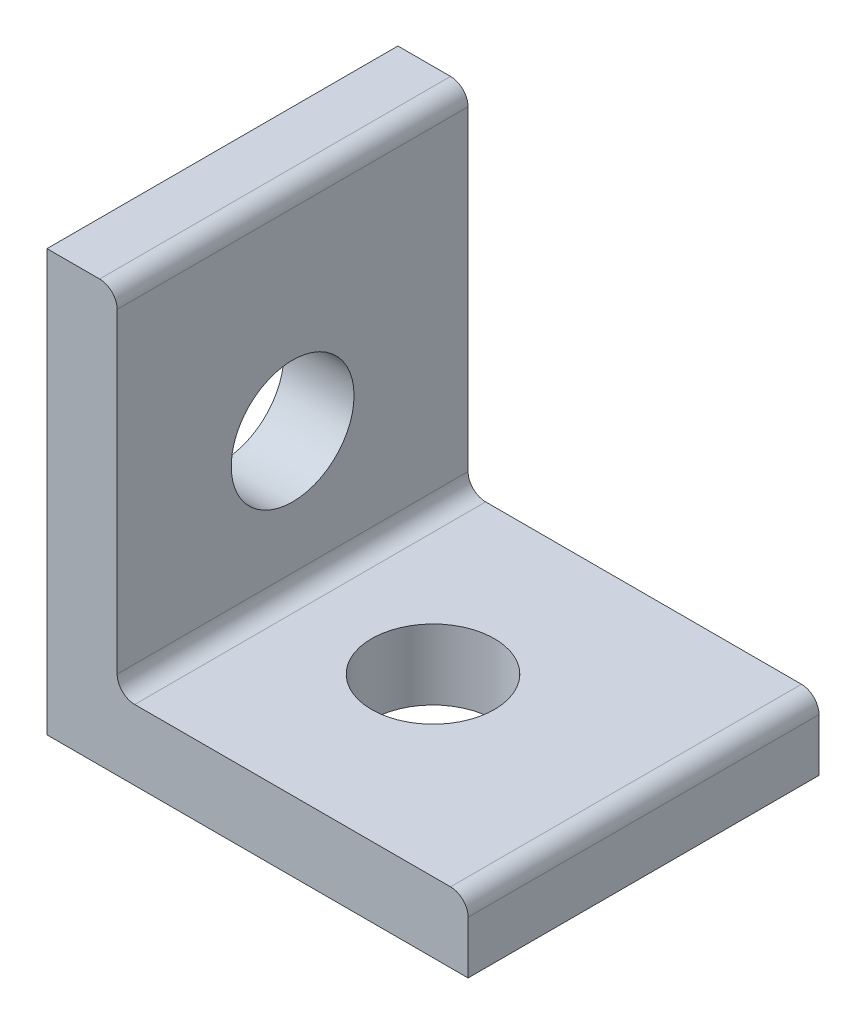
ISO-10303-21;
HEADER;
FILE_DESCRIPTION(('STEP AP214'),'2;1');
FILE_NAME('part.step','',(''),(''),'','','');
FILE_SCHEMA(('AUTOMOTIVE_DESIGN { 1 0 10303 214 1 1 1 1 }'));
ENDSEC;
DATA;
#1=APPLICATION_CONTEXT('core data for automotive mechanical design processes');
#2=APPLICATION_PROTOCOL_DEFINITION('international standard','automotive_design',2000,#1);
#3=PRODUCT_CONTEXT('',#1,'mechanical');
#4=PRODUCT('Part','Part','',(#3));
#5=PRODUCT_RELATED_PRODUCT_CATEGORY('part','',(#4));
#6=PRODUCT_DEFINITION_FORMATION('','',#4);
#7=PRODUCT_DEFINITION_CONTEXT('part definition',#1,'design');
#8=PRODUCT_DEFINITION('design','',#6,#7);
#9=PRODUCT_DEFINITION_SHAPE('','',#8);
#10=(LENGTH_UNIT() NAMED_UNIT(*) SI_UNIT(.MILLI.,.METRE.));
#11=(NAMED_UNIT(*) PLANE_ANGLE_UNIT() SI_UNIT($,.RADIAN.));
#12=(NAMED_UNIT(*) SI_UNIT($,.STERADIAN.) SOLID_ANGLE_UNIT());
#13=UNCERTAINTY_MEASURE_WITH_UNIT(LENGTH_MEASURE(1.E-05),#10,'distance_accuracy_value','');
#14=(GEOMETRIC_REPRESENTATION_CONTEXT(3) GLOBAL_UNCERTAINTY_ASSIGNED_CONTEXT((#13)) GLOBAL_UNIT_ASSIGNED_CONTEXT((#10,
#11,#12)) REPRESENTATION_CONTEXT('',''));
#15=CARTESIAN_POINT('',(0.,0.,0.));
#16=DIRECTION('',(0.,0.,1.));
#17=DIRECTION('',(1.,0.,0.));
#18=AXIS2_PLACEMENT_3D('',#15,#16,#17);
#19=CARTESIAN_POINT('',(-6.,6.,4.99999999999999));
#20=DIRECTION('',(0.,-1.,0.));
#21=DIRECTION('',(0.,0.,-1.));
#22=AXIS2_PLACEMENT_3D('',#19,#20,#21);
#23=PLANE('',#22);
#24=DIRECTION('',(-1.,0.,0.));
#25=VECTOR('',#24,1.);
#26=CARTESIAN_POINT('',(-6.,6.,-5.));
#27=LINE('',#26,#25);
#28=CARTESIAN_POINT('',(-4.5,6.,-5.));
#29=VERTEX_POINT('',#28);
#30=CARTESIAN_POINT('',(-6.,6.,-5.));
#31=VERTEX_POINT('',#30);
#32=EDGE_CURVE('E151',#29,#31,#27,.T.);
#33=ORIENTED_EDGE('',*,*,#32,.T.);
#34=DIRECTION('',(0.,0.,-1.));
#35=VECTOR('',#34,1.);
#36=CARTESIAN_POINT('',(-6.,6.,4.99999999999999));
#37=LINE('',#36,#35);
#38=CARTESIAN_POINT('',(-6.,6.,4.99999999999999));
#39=VERTEX_POINT('',#38);
#40=EDGE_CURVE('E11',#39,#31,#37,.T.);
#41=ORIENTED_EDGE('',*,*,#40,.F.);
#42=DIRECTION('',(-1.,0.,0.));
#43=VECTOR('',#42,1.);
#44=CARTESIAN_POINT('',(-6.,6.,4.99999999999999));
#45=LINE('',#44,#43);
#46=CARTESIAN_POINT('',(-4.5,6.,4.99999999999999));
#47=VERTEX_POINT('',#46);
#48=EDGE_CURVE('E177',#47,#39,#45,.T.);
#49=ORIENTED_EDGE('',*,*,#48,.F.);
#50=DIRECTION('',(0.,0.,-1.));
#51=VECTOR('',#50,1.);
#52=CARTESIAN_POINT('',(-4.5,6.,4.99999999999999));
#53=LINE('',#52,#51);
#54=EDGE_CURVE('E147',#47,#29,#53,.T.);
#55=ORIENTED_EDGE('',*,*,#54,.T.);
#56=EDGE_LOOP('',(#33,#41,#49,#55));
#57=FACE_BOUND('',#56,.T.);
#58=ADVANCED_FACE('F41',(#57),#23,.F.);
#59=CARTESIAN_POINT('',(-6.,6.,4.99999999999999));
#60=DIRECTION('',(1.,0.,0.));
#61=DIRECTION('',(0.,0.,-1.));
#62=AXIS2_PLACEMENT_3D('',#59,#60,#61);
#63=PLANE('',#62);
#64=CARTESIAN_POINT('',(-6.,0.,0.));
#65=DIRECTION('',(1.,0.,0.));
#66=DIRECTION('',(0.,0.,-1.));
#67=AXIS2_PLACEMENT_3D('',#64,#65,#66);
#68=CIRCLE('',#67,1.75);
#69=CARTESIAN_POINT('',(-6.,0.,-1.75));
#70=VERTEX_POINT('',#69);
#71=EDGE_CURVE('E200',#70,#70,#68,.T.);
#72=ORIENTED_EDGE('',*,*,#71,.T.);
#73=EDGE_LOOP('',(#72));
#74=FACE_BOUND('',#73,.T.);
#75=DIRECTION('',(0.,-1.,0.));
#76=VECTOR('',#75,1.);
#77=CARTESIAN_POINT('',(-6.,6.,-5.));
#78=LINE('',#77,#76);
#79=CARTESIAN_POINT('',(-6.,-6.,-5.));
#80=VERTEX_POINT('',#79);
#81=EDGE_CURVE('E155',#31,#80,#78,.T.);
#82=ORIENTED_EDGE('',*,*,#81,.T.);
#83=DIRECTION('',(0.,0.,-1.));
#84=VECTOR('',#83,1.);
#85=CARTESIAN_POINT('',(-6.,-6.,4.99999999999999));
#86=LINE('',#85,#84);
#87=CARTESIAN_POINT('',(-6.,-6.,4.99999999999999));
#88=VERTEX_POINT('',#87);
#89=EDGE_CURVE('E51',#88,#80,#86,.T.);
#90=ORIENTED_EDGE('',*,*,#89,.F.);
#91=DIRECTION('',(0.,-1.,0.));
#92=VECTOR('',#91,1.);
#93=CARTESIAN_POINT('',(-6.,6.,4.99999999999999));
#94=LINE('',#93,#92);
#95=EDGE_CURVE('E106',#39,#88,#94,.T.);
#96=ORIENTED_EDGE('',*,*,#95,.F.);
#97=ORIENTED_EDGE('',*,*,#40,.T.);
#98=EDGE_LOOP('',(#82,#90,#96,#97));
#99=FACE_BOUND('',#98,.T.);
#100=ADVANCED_FACE('F272',(#74,#99),#63,.F.);
#101=CARTESIAN_POINT('',(-6.,-6.,4.99999999999999));
#102=DIRECTION('',(0.,1.,0.));
#103=DIRECTION('',(0.,0.,1.));
#104=AXIS2_PLACEMENT_3D('',#101,#102,#103);
#105=PLANE('',#104);
#106=CARTESIAN_POINT('',(0.,-6.,0.));
#107=DIRECTION('',(0.,1.,0.));
#108=DIRECTION('',(0.,0.,1.));
#109=AXIS2_PLACEMENT_3D('',#106,#107,#108);
#110=CIRCLE('',#109,1.75);
#111=CARTESIAN_POINT('',(0.,-6.,1.75));
#112=VERTEX_POINT('',#111);
#113=EDGE_CURVE('E212',#112,#112,#110,.T.);
#114=ORIENTED_EDGE('',*,*,#113,.T.);
#115=EDGE_LOOP('',(#114));
#116=FACE_BOUND('',#115,.T.);
#117=DIRECTION('',(1.,0.,0.));
#118=VECTOR('',#117,1.);
#119=CARTESIAN_POINT('',(-6.,-6.,-5.));
#120=LINE('',#119,#118);
#121=CARTESIAN_POINT('',(6.,-6.,-5.));
#122=VERTEX_POINT('',#121);
#123=EDGE_CURVE('E159',#80,#122,#120,.T.);
#124=ORIENTED_EDGE('',*,*,#123,.T.);
#125=DIRECTION('',(0.,0.,-1.));
#126=VECTOR('',#125,1.);
#127=CARTESIAN_POINT('',(6.,-6.,4.99999999999999));
#128=LINE('',#127,#126);
#129=CARTESIAN_POINT('',(6.,-6.,4.99999999999999));
#130=VERTEX_POINT('',#129);
#131=EDGE_CURVE('E192',#130,#122,#128,.T.);
#132=ORIENTED_EDGE('',*,*,#131,.F.);
#133=DIRECTION('',(1.,0.,0.));
#134=VECTOR('',#133,1.);
#135=CARTESIAN_POINT('',(-6.,-6.,4.99999999999999));
#136=LINE('',#135,#134);
#137=EDGE_CURVE('E219',#88,#130,#136,.T.);
#138=ORIENTED_EDGE('',*,*,#137,.F.);
#139=ORIENTED_EDGE('',*,*,#89,.T.);
#140=EDGE_LOOP('',(#124,#132,#138,#139));
#141=FACE_BOUND('',#140,.T.);
#142=ADVANCED_FACE('F276',(#116,#141),#105,.F.);
#143=CARTESIAN_POINT('',(6.,-6.,4.99999999999999));
#144=DIRECTION('',(-1.,0.,0.));
#145=DIRECTION('',(0.,0.,1.));
#146=AXIS2_PLACEMENT_3D('',#143,#144,#145);
#147=PLANE('',#146);
#148=DIRECTION('',(0.,1.,0.));
#149=VECTOR('',#148,1.);
#150=CARTESIAN_POINT('',(6.,-6.,-5.));
#151=LINE('',#150,#149);
#152=CARTESIAN_POINT('',(6.,-4.5,-5.));
#153=VERTEX_POINT('',#152);
#154=EDGE_CURVE('E162',#122,#153,#151,.T.);
#155=ORIENTED_EDGE('',*,*,#154,.T.);
#156=DIRECTION('',(0.,0.,-1.));
#157=VECTOR('',#156,1.);
#158=CARTESIAN_POINT('',(6.,-4.5,4.99999999999999));
#159=LINE('',#158,#157);
#160=CARTESIAN_POINT('',(6.,-4.5,4.99999999999999));
#161=VERTEX_POINT('',#160);
#162=EDGE_CURVE('E188',#161,#153,#159,.T.);
#163=ORIENTED_EDGE('',*,*,#162,.F.);
#164=DIRECTION('',(0.,1.,0.));
#165=VECTOR('',#164,1.);
#166=CARTESIAN_POINT('',(6.,-6.,4.99999999999999));
#167=LINE('',#166,#165);
#168=EDGE_CURVE('E222',#130,#161,#167,.T.);
#169=ORIENTED_EDGE('',*,*,#168,.F.);
#170=ORIENTED_EDGE('',*,*,#131,.T.);
#171=EDGE_LOOP('',(#155,#163,#169,#170));
#172=FACE_BOUND('',#171,.T.);
#173=ADVANCED_FACE('F280',(#172),#147,.F.);
#174=CARTESIAN_POINT('',(5.5,-4.5,4.99999999999999));
#175=DIRECTION('',(0.,0.,-1.));
#176=DIRECTION('',(-1.,0.,0.));
#177=AXIS2_PLACEMENT_3D('',#174,#175,#176);
#178=CYLINDRICAL_SURFACE('',#177,0.5);
#179=CARTESIAN_POINT('',(5.5,-4.5,-5.));
#180=DIRECTION('',(0.,0.,1.));
#181=DIRECTION('',(1.,0.,0.));
#182=AXIS2_PLACEMENT_3D('',#179,#180,#181);
#183=CIRCLE('',#182,0.5);
#184=CARTESIAN_POINT('',(5.5,-4.,-5.));
#185=VERTEX_POINT('',#184);
#186=EDGE_CURVE('E165',#153,#185,#183,.T.);
#187=ORIENTED_EDGE('',*,*,#186,.T.);
#188=DIRECTION('',(0.,0.,-1.));
#189=VECTOR('',#188,1.);
#190=CARTESIAN_POINT('',(5.5,-4.,4.99999999999999));
#191=LINE('',#190,#189);
#192=CARTESIAN_POINT('',(5.5,-4.,4.99999999999999));
#193=VERTEX_POINT('',#192);
#194=EDGE_CURVE('E184',#193,#185,#191,.T.);
#195=ORIENTED_EDGE('',*,*,#194,.F.);
#196=CARTESIAN_POINT('',(5.5,-4.5,4.99999999999999));
#197=DIRECTION('',(0.,0.,1.));
#198=DIRECTION('',(1.,0.,0.));
#199=AXIS2_PLACEMENT_3D('',#196,#197,#198);
#200=CIRCLE('',#199,0.5);
#201=EDGE_CURVE('E225',#161,#193,#200,.T.);
#202=ORIENTED_EDGE('',*,*,#201,.F.);
#203=ORIENTED_EDGE('',*,*,#162,.T.);
#204=EDGE_LOOP('',(#187,#195,#202,#203));
#205=FACE_BOUND('',#204,.T.);
#206=ADVANCED_FACE('F249',(#205),#178,.T.);
#207=CARTESIAN_POINT('',(5.5,-4.,4.99999999999999));
#208=DIRECTION('',(0.,-1.,0.));
#209=DIRECTION('',(1.,0.,0.));
#210=AXIS2_PLACEMENT_3D('',#207,#208,#209);
#211=PLANE('',#210);
#212=CARTESIAN_POINT('',(0.,-4.,0.));
#213=DIRECTION('',(0.,-1.,0.));
#214=DIRECTION('',(1.,0.,0.));
#215=AXIS2_PLACEMENT_3D('',#212,#213,#214);
#216=CIRCLE('',#215,1.75);
#217=CARTESIAN_POINT('',(0.,-4.,1.75));
#218=VERTEX_POINT('',#217);
#219=EDGE_CURVE('E44',#218,#218,#216,.T.);
#220=ORIENTED_EDGE('',*,*,#219,.T.);
#221=EDGE_LOOP('',(#220));
#222=FACE_BOUND('',#221,.T.);
#223=DIRECTION('',(-1.,0.,0.));
#224=VECTOR('',#223,1.);
#225=CARTESIAN_POINT('',(5.5,-4.,-5.));
#226=LINE('',#225,#224);
#227=CARTESIAN_POINT('',(-3.5,-4.,-5.));
#228=VERTEX_POINT('',#227);
#229=EDGE_CURVE('E168',#185,#228,#226,.T.);
#230=ORIENTED_EDGE('',*,*,#229,.T.);
#231=DIRECTION('',(0.,0.,-1.));
#232=VECTOR('',#231,1.);
#233=CARTESIAN_POINT('',(-3.5,-4.,4.99999999999999));
#234=LINE('',#233,#232);
#235=CARTESIAN_POINT('',(-3.5,-4.,4.99999999999999));
#236=VERTEX_POINT('',#235);
#237=EDGE_CURVE('E139',#236,#228,#234,.T.);
#238=ORIENTED_EDGE('',*,*,#237,.F.);
#239=DIRECTION('',(-1.,0.,0.));
#240=VECTOR('',#239,1.);
#241=CARTESIAN_POINT('',(5.5,-4.,4.99999999999999));
#242=LINE('',#241,#240);
#243=EDGE_CURVE('E128',#193,#236,#242,.T.);
#244=ORIENTED_EDGE('',*,*,#243,.F.);
#245=ORIENTED_EDGE('',*,*,#194,.T.);
#246=EDGE_LOOP('',(#230,#238,#244,#245));
#247=FACE_BOUND('',#246,.T.);
#248=ADVANCED_FACE('F253',(#222,#247),#211,.F.);
#249=CARTESIAN_POINT('',(-3.5,-3.5,4.99999999999999));
#250=DIRECTION('',(0.,0.,-1.));
#251=DIRECTION('',(-1.,0.,0.));
#252=AXIS2_PLACEMENT_3D('',#249,#250,#251);
#253=CYLINDRICAL_SURFACE('',#252,0.5);
#254=CARTESIAN_POINT('',(-3.5,-3.5,-5.));
#255=DIRECTION('',(0.,0.,-1.));
#256=DIRECTION('',(-1.,0.,0.));
#257=AXIS2_PLACEMENT_3D('',#254,#255,#256);
#258=CIRCLE('',#257,0.5);
#259=CARTESIAN_POINT('',(-4.,-3.5,-5.));
#260=VERTEX_POINT('',#259);
#261=EDGE_CURVE('E137',#228,#260,#258,.T.);
#262=ORIENTED_EDGE('',*,*,#261,.T.);
#263=DIRECTION('',(0.,0.,-1.));
#264=VECTOR('',#263,1.);
#265=CARTESIAN_POINT('',(-4.,-3.5,4.99999999999999));
#266=LINE('',#265,#264);
#267=CARTESIAN_POINT('',(-4.,-3.5,4.99999999999999));
#268=VERTEX_POINT('',#267);
#269=EDGE_CURVE('E134',#268,#260,#266,.T.);
#270=ORIENTED_EDGE('',*,*,#269,.F.);
#271=CARTESIAN_POINT('',(-3.5,-3.5,4.99999999999999));
#272=DIRECTION('',(0.,0.,-1.));
#273=DIRECTION('',(-1.,0.,0.));
#274=AXIS2_PLACEMENT_3D('',#271,#272,#273);
#275=CIRCLE('',#274,0.5);
#276=EDGE_CURVE('E122',#236,#268,#275,.T.);
#277=ORIENTED_EDGE('',*,*,#276,.F.);
#278=ORIENTED_EDGE('',*,*,#237,.T.);
#279=EDGE_LOOP('',(#262,#270,#277,#278));
#280=FACE_BOUND('',#279,.T.);
#281=ADVANCED_FACE('F135',(#280),#253,.F.);
#282=CARTESIAN_POINT('',(-4.,-3.5,4.99999999999999));
#283=DIRECTION('',(-1.,0.,0.));
#284=DIRECTION('',(0.,-1.,0.));
#285=AXIS2_PLACEMENT_3D('',#282,#283,#284);
#286=PLANE('',#285);
#287=CARTESIAN_POINT('',(-4.,0.,0.));
#288=DIRECTION('',(-1.,0.,0.));
#289=DIRECTION('',(0.,-1.,0.));
#290=AXIS2_PLACEMENT_3D('',#287,#288,#289);
#291=CIRCLE('',#290,1.75);
#292=CARTESIAN_POINT('',(-4.,-1.75,0.));
#293=VERTEX_POINT('',#292);
#294=EDGE_CURVE('E156',#293,#293,#291,.T.);
#295=ORIENTED_EDGE('',*,*,#294,.T.);
#296=EDGE_LOOP('',(#295));
#297=FACE_BOUND('',#296,.T.);
#298=DIRECTION('',(0.,1.,0.));
#299=VECTOR('',#298,1.);
#300=CARTESIAN_POINT('',(-4.,-3.5,-5.));
#301=LINE('',#300,#299);
#302=CARTESIAN_POINT('',(-4.,5.5,-5.));
#303=VERTEX_POINT('',#302);
#304=EDGE_CURVE('E92',#260,#303,#301,.T.);
#305=ORIENTED_EDGE('',*,*,#304,.T.);
#306=DIRECTION('',(0.,0.,-1.));
#307=VECTOR('',#306,1.);
#308=CARTESIAN_POINT('',(-4.,5.5,4.99999999999999));
#309=LINE('',#308,#307);
#310=CARTESIAN_POINT('',(-4.,5.5,4.99999999999999));
#311=VERTEX_POINT('',#310);
#312=EDGE_CURVE('E140',#311,#303,#309,.T.);
#313=ORIENTED_EDGE('',*,*,#312,.F.);
#314=DIRECTION('',(0.,1.,0.));
#315=VECTOR('',#314,1.);
#316=CARTESIAN_POINT('',(-4.,-3.5,4.99999999999999));
#317=LINE('',#316,#315);
#318=EDGE_CURVE('E126',#268,#311,#317,.T.);
#319=ORIENTED_EDGE('',*,*,#318,.F.);
#320=ORIENTED_EDGE('',*,*,#269,.T.);
#321=EDGE_LOOP('',(#305,#313,#319,#320));
#322=FACE_BOUND('',#321,.T.);
#323=ADVANCED_FACE('F142',(#297,#322),#286,.F.);
#324=CARTESIAN_POINT('',(-4.5,5.5,4.99999999999999));
#325=DIRECTION('',(0.,0.,-1.));
#326=DIRECTION('',(-1.,0.,0.));
#327=AXIS2_PLACEMENT_3D('',#324,#325,#326);
#328=CYLINDRICAL_SURFACE('',#327,0.5);
#329=CARTESIAN_POINT('',(-4.5,5.5,-5.));
#330=DIRECTION('',(0.,0.,1.));
#331=DIRECTION('',(1.,0.,0.));
#332=AXIS2_PLACEMENT_3D('',#329,#330,#331);
#333=CIRCLE('',#332,0.5);
#334=EDGE_CURVE('E98',#303,#29,#333,.T.);
#335=ORIENTED_EDGE('',*,*,#334,.T.);
#336=ORIENTED_EDGE('',*,*,#54,.F.);
#337=CARTESIAN_POINT('',(-4.5,5.5,4.99999999999999));
#338=DIRECTION('',(0.,0.,1.));
#339=DIRECTION('',(1.,0.,0.));
#340=AXIS2_PLACEMENT_3D('',#337,#338,#339);
#341=CIRCLE('',#340,0.5);
#342=EDGE_CURVE('E60',#311,#47,#341,.T.);
#343=ORIENTED_EDGE('',*,*,#342,.F.);
#344=ORIENTED_EDGE('',*,*,#312,.T.);
#345=EDGE_LOOP('',(#335,#336,#343,#344));
#346=FACE_BOUND('',#345,.T.);
#347=ADVANCED_FACE('F261',(#346),#328,.T.);
#348=CARTESIAN_POINT('',(-4.5,5.5,4.99999999999999));
#349=DIRECTION('',(0.,0.,1.));
#350=DIRECTION('',(1.,0.,0.));
#351=AXIS2_PLACEMENT_3D('',#348,#349,#350);
#352=PLANE('',#351);
#353=ORIENTED_EDGE('',*,*,#48,.T.);
#354=ORIENTED_EDGE('',*,*,#95,.T.);
#355=ORIENTED_EDGE('',*,*,#137,.T.);
#356=ORIENTED_EDGE('',*,*,#168,.T.);
#357=ORIENTED_EDGE('',*,*,#201,.T.);
#358=ORIENTED_EDGE('',*,*,#243,.T.);
#359=ORIENTED_EDGE('',*,*,#276,.T.);
#360=ORIENTED_EDGE('',*,*,#318,.T.);
#361=ORIENTED_EDGE('',*,*,#342,.T.);
#362=EDGE_LOOP('',(#353,#354,#355,#356,#357,#358,#359,#360,#361));
#363=FACE_BOUND('',#362,.T.);
#364=ADVANCED_FACE('F124',(#363),#352,.T.);
#365=CARTESIAN_POINT('',(-4.5,5.5,-5.));
#366=DIRECTION('',(0.,0.,1.));
#367=DIRECTION('',(1.,0.,0.));
#368=AXIS2_PLACEMENT_3D('',#365,#366,#367);
#369=PLANE('',#368);
#370=ORIENTED_EDGE('',*,*,#32,.F.);
#371=ORIENTED_EDGE('',*,*,#334,.F.);
#372=ORIENTED_EDGE('',*,*,#304,.F.);
#373=ORIENTED_EDGE('',*,*,#261,.F.);
#374=ORIENTED_EDGE('',*,*,#229,.F.);
#375=ORIENTED_EDGE('',*,*,#186,.F.);
#376=ORIENTED_EDGE('',*,*,#154,.F.);
#377=ORIENTED_EDGE('',*,*,#123,.F.);
#378=ORIENTED_EDGE('',*,*,#81,.F.);
#379=EDGE_LOOP('',(#370,#371,#372,#373,#374,#375,#376,#377,#378));
#380=FACE_BOUND('',#379,.T.);
#381=ADVANCED_FACE('F256',(#380),#369,.F.);
#382=CARTESIAN_POINT('',(-6.,0.,0.));
#383=DIRECTION('',(1.,0.,0.));
#384=DIRECTION('',(0.,0.,-1.));
#385=AXIS2_PLACEMENT_3D('',#382,#383,#384);
#386=CYLINDRICAL_SURFACE('',#385,1.75);
#387=ORIENTED_EDGE('',*,*,#71,.F.);
#388=EDGE_LOOP('',(#387));
#389=FACE_BOUND('',#388,.T.);
#390=ORIENTED_EDGE('',*,*,#294,.F.);
#391=EDGE_LOOP('',(#390));
#392=FACE_BOUND('',#391,.T.);
#393=ADVANCED_FACE('F311',(#389,#392),#386,.F.);
#394=CARTESIAN_POINT('',(0.,-6.,0.));
#395=DIRECTION('',(0.,1.,0.));
#396=DIRECTION('',(0.,0.,1.));
#397=AXIS2_PLACEMENT_3D('',#394,#395,#396);
#398=CYLINDRICAL_SURFACE('',#397,1.75);
#399=CARTESIAN_POINT('',(0.,-6.,1.75));
#400=CARTESIAN_POINT('',(0.,-5.97916666666667,1.75));
#401=CARTESIAN_POINT('',(0.,-5.95833333333334,1.75));
#402=CARTESIAN_POINT('',(0.,-5.91666666666667,1.75));
#403=CARTESIAN_POINT('',(0.,-5.89583333333334,1.75));
#404=CARTESIAN_POINT('',(0.,-5.85416666666667,1.75));
#405=CARTESIAN_POINT('',(0.,-5.83333333333333,1.75));
#406=CARTESIAN_POINT('',(0.,-5.79166666666667,1.75));
#407=CARTESIAN_POINT('',(0.,-5.77083333333333,1.75));
#408=CARTESIAN_POINT('',(0.,-5.72916666666667,1.75));
#409=CARTESIAN_POINT('',(0.,-5.70833333333333,1.75));
#410=CARTESIAN_POINT('',(0.,-5.66666666666667,1.75));
#411=CARTESIAN_POINT('',(0.,-5.64583333333333,1.75));
#412=CARTESIAN_POINT('',(0.,-5.60416666666667,1.75));
#413=CARTESIAN_POINT('',(0.,-5.58333333333333,1.75));
#414=CARTESIAN_POINT('',(0.,-5.54166666666667,1.75));
#415=CARTESIAN_POINT('',(0.,-5.52083333333333,1.75));
#416=CARTESIAN_POINT('',(0.,-5.47916666666667,1.75));
#417=CARTESIAN_POINT('',(0.,-5.45833333333333,1.75));
#418=CARTESIAN_POINT('',(0.,-5.41666666666667,1.75));
#419=CARTESIAN_POINT('',(0.,-5.39583333333333,1.75));
#420=CARTESIAN_POINT('',(0.,-5.35416666666667,1.75));
#421=CARTESIAN_POINT('',(0.,-5.33333333333333,1.75));
#422=CARTESIAN_POINT('',(0.,-5.29166666666667,1.75));
#423=CARTESIAN_POINT('',(0.,-5.27083333333333,1.75));
#424=CARTESIAN_POINT('',(0.,-5.22916666666667,1.75));
#425=CARTESIAN_POINT('',(0.,-5.20833333333333,1.75));
#426=CARTESIAN_POINT('',(0.,-5.16666666666667,1.75));
#427=CARTESIAN_POINT('',(0.,-5.14583333333333,1.75));
#428=CARTESIAN_POINT('',(0.,-5.10416666666667,1.75));
#429=CARTESIAN_POINT('',(0.,-5.08333333333333,1.75));
#430=CARTESIAN_POINT('',(0.,-5.04166666666667,1.75));
#431=CARTESIAN_POINT('',(0.,-5.02083333333333,1.75));
#432=CARTESIAN_POINT('',(0.,-4.97916666666667,1.75));
#433=CARTESIAN_POINT('',(0.,-4.95833333333333,1.75));
#434=CARTESIAN_POINT('',(0.,-4.91666666666667,1.75));
#435=CARTESIAN_POINT('',(0.,-4.89583333333333,1.75));
#436=CARTESIAN_POINT('',(0.,-4.85416666666667,1.75));
#437=CARTESIAN_POINT('',(0.,-4.83333333333333,1.75));
#438=CARTESIAN_POINT('',(0.,-4.79166666666667,1.75));
#439=CARTESIAN_POINT('',(0.,-4.77083333333333,1.75));
#440=CARTESIAN_POINT('',(0.,-4.72916666666667,1.75));
#441=CARTESIAN_POINT('',(0.,-4.70833333333333,1.75));
#442=CARTESIAN_POINT('',(0.,-4.66666666666667,1.75));
#443=CARTESIAN_POINT('',(0.,-4.64583333333333,1.75));
#444=CARTESIAN_POINT('',(0.,-4.60416666666667,1.75));
#445=CARTESIAN_POINT('',(0.,-4.58333333333333,1.75));
#446=CARTESIAN_POINT('',(0.,-4.54166666666667,1.75));
#447=CARTESIAN_POINT('',(0.,-4.52083333333333,1.75));
#448=CARTESIAN_POINT('',(0.,-4.47916666666667,1.75));
#449=CARTESIAN_POINT('',(0.,-4.45833333333333,1.75));
#450=CARTESIAN_POINT('',(0.,-4.41666666666667,1.75));
#451=CARTESIAN_POINT('',(0.,-4.39583333333333,1.75));
#452=CARTESIAN_POINT('',(0.,-4.35416666666667,1.75));
#453=CARTESIAN_POINT('',(0.,-4.33333333333333,1.75));
#454=CARTESIAN_POINT('',(0.,-4.29166666666667,1.75));
#455=CARTESIAN_POINT('',(0.,-4.27083333333333,1.75));
#456=CARTESIAN_POINT('',(0.,-4.22916666666667,1.75));
#457=CARTESIAN_POINT('',(0.,-4.20833333333333,1.75));
#458=CARTESIAN_POINT('',(0.,-4.16666666666667,1.75));
#459=CARTESIAN_POINT('',(0.,-4.14583333333333,1.75));
#460=CARTESIAN_POINT('',(0.,-4.10416666666667,1.75));
#461=CARTESIAN_POINT('',(0.,-4.08333333333333,1.75));
#462=CARTESIAN_POINT('',(0.,-4.04166666666667,1.75));
#463=CARTESIAN_POINT('',(0.,-4.02083333333333,1.75));
#464=CARTESIAN_POINT('',(0.,-4.,1.75));
#465=B_SPLINE_CURVE_WITH_KNOTS('',3,(#399,#400,#401,#402,#403,#404,#405,#406,#407,#408,#409,
#410,#411,#412,#413,#414,#415,#416,#417,#418,#419,#420,#421,#422,#423,#424,#425,#426,#427,#428,
#429,#430,#431,#432,#433,#434,#435,#436,#437,#438,#439,#440,#441,#442,#443,#444,#445,#446,#447,
#448,#449,#450,#451,#452,#453,#454,#455,#456,#457,#458,#459,#460,#461,#462,#463,#464),
.UNSPECIFIED.,.F.,.F.,(4,2,2,2,2,2,2,2,2,2,2,2,2,2,2,2,2,2,2,2,2,2,2,2,2,2,2,2,2,2,2,2,4),(0.,
0.0625000000000001,0.125,0.187500000000001,0.25,0.3125,0.375000000000001,0.437500000000001,0.5,
0.5625,0.625000000000001,0.687500000000001,0.750000000000002,0.812500000000002,
0.875000000000002,0.937500000000002,1.,1.0625,1.125,1.1875,1.25,1.3125,1.375,1.4375,1.5,1.5625,
1.625,1.6875,1.75,1.8125,1.875,1.9375,2.),.UNSPECIFIED.);
#466=EDGE_CURVE('BSEAM316',#112,#218,#465,.T.);
#467=ORIENTED_EDGE('',*,*,#113,.F.);
#468=ORIENTED_EDGE('',*,*,#219,.F.);
#469=ORIENTED_EDGE('',*,*,#466,.T.);
#470=ORIENTED_EDGE('',*,*,#466,.F.);
#471=EDGE_LOOP('',(#467,#469,#468,#470));
#472=FACE_BOUND('',#471,.T.);
#473=ADVANCED_FACE('F316',(#472),#398,.F.);
#474=CLOSED_SHELL('',(#58,#100,#142,#173,#206,#248,#281,#323,#347,#364,#381,#393,#473));
#475=MANIFOLD_SOLID_BREP('B2',#474);
#476=ADVANCED_BREP_SHAPE_REPRESENTATION('',(#18,#475),#14);
#477=SHAPE_DEFINITION_REPRESENTATION(#9,#476);
ENDSEC;
END-ISO-10303-21;
